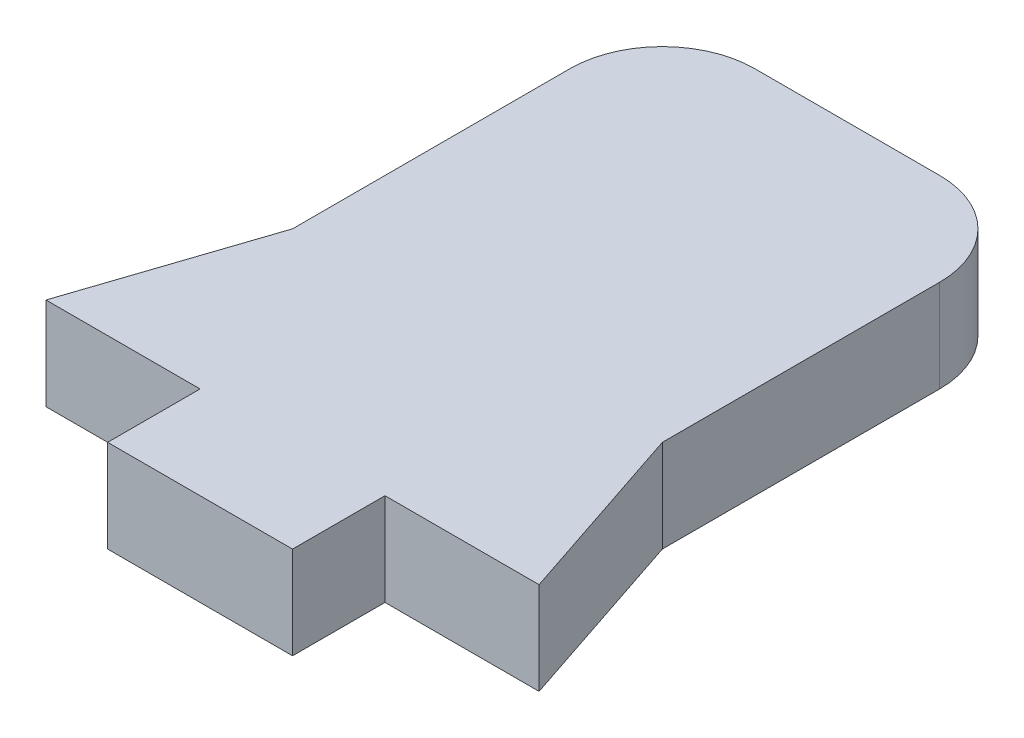
ISO-10303-21;
HEADER;
FILE_DESCRIPTION(('STEP AP214'),'2;1');
FILE_NAME('part.step','',(''),(''),'','','');
FILE_SCHEMA(('AUTOMOTIVE_DESIGN { 1 0 10303 214 1 1 1 1 }'));
ENDSEC;
DATA;
#1=APPLICATION_CONTEXT('core data for automotive mechanical design processes');
#2=APPLICATION_PROTOCOL_DEFINITION('international standard','automotive_design',2000,#1);
#3=PRODUCT_CONTEXT('',#1,'mechanical');
#4=PRODUCT('Part','Part','',(#3));
#5=PRODUCT_RELATED_PRODUCT_CATEGORY('part','',(#4));
#6=PRODUCT_DEFINITION_FORMATION('','',#4);
#7=PRODUCT_DEFINITION_CONTEXT('part definition',#1,'design');
#8=PRODUCT_DEFINITION('design','',#6,#7);
#9=PRODUCT_DEFINITION_SHAPE('','',#8);
#10=(LENGTH_UNIT() NAMED_UNIT(*) SI_UNIT(.MILLI.,.METRE.));
#11=(NAMED_UNIT(*) PLANE_ANGLE_UNIT() SI_UNIT($,.RADIAN.));
#12=(NAMED_UNIT(*) SI_UNIT($,.STERADIAN.) SOLID_ANGLE_UNIT());
#13=UNCERTAINTY_MEASURE_WITH_UNIT(LENGTH_MEASURE(1.E-05),#10,'distance_accuracy_value','');
#14=(GEOMETRIC_REPRESENTATION_CONTEXT(3) GLOBAL_UNCERTAINTY_ASSIGNED_CONTEXT((#13)) GLOBAL_UNIT_ASSIGNED_CONTEXT((#10,
#11,#12)) REPRESENTATION_CONTEXT('',''));
#15=CARTESIAN_POINT('',(0.,0.,0.));
#16=DIRECTION('',(0.,0.,1.));
#17=DIRECTION('',(1.,0.,0.));
#18=AXIS2_PLACEMENT_3D('',#15,#16,#17);
#19=CARTESIAN_POINT('',(6.,1.5,-7.5));
#20=DIRECTION('',(-1.,0.,0.));
#21=DIRECTION('',(0.,0.,1.));
#22=AXIS2_PLACEMENT_3D('',#19,#20,#21);
#23=PLANE('',#22);
#24=DIRECTION('',(0.,-1.,0.));
#25=VECTOR('',#24,1.);
#26=CARTESIAN_POINT('',(6.,1.5,1.5));
#27=LINE('',#26,#25);
#28=CARTESIAN_POINT('',(6.,1.5,1.5));
#29=VERTEX_POINT('',#28);
#30=CARTESIAN_POINT('',(6.,-1.5,1.5));
#31=VERTEX_POINT('',#30);
#32=EDGE_CURVE('E157',#29,#31,#27,.T.);
#33=ORIENTED_EDGE('',*,*,#32,.T.);
#34=DIRECTION('',(0.,0.,-1.));
#35=VECTOR('',#34,1.);
#36=CARTESIAN_POINT('',(6.,-1.5,-7.5));
#37=LINE('',#36,#35);
#38=CARTESIAN_POINT('',(6.,-1.5,-7.5));
#39=VERTEX_POINT('',#38);
#40=EDGE_CURVE('E215',#31,#39,#37,.T.);
#41=ORIENTED_EDGE('',*,*,#40,.T.);
#42=DIRECTION('',(0.,-1.,0.));
#43=VECTOR('',#42,1.);
#44=CARTESIAN_POINT('',(6.,1.5,-7.5));
#45=LINE('',#44,#43);
#46=CARTESIAN_POINT('',(6.,1.5,-7.5));
#47=VERTEX_POINT('',#46);
#48=EDGE_CURVE('E11',#47,#39,#45,.T.);
#49=ORIENTED_EDGE('',*,*,#48,.F.);
#50=DIRECTION('',(0.,0.,-1.));
#51=VECTOR('',#50,1.);
#52=CARTESIAN_POINT('',(6.,1.5,-7.5));
#53=LINE('',#52,#51);
#54=EDGE_CURVE('E58',#29,#47,#53,.T.);
#55=ORIENTED_EDGE('',*,*,#54,.F.);
#56=EDGE_LOOP('',(#33,#41,#49,#55));
#57=FACE_BOUND('',#56,.T.);
#58=ADVANCED_FACE('F43',(#57),#23,.F.);
#59=CARTESIAN_POINT('',(-6.,1.5,-7.5));
#60=DIRECTION('',(1.,0.,0.));
#61=DIRECTION('',(0.,0.,-1.));
#62=AXIS2_PLACEMENT_3D('',#59,#60,#61);
#63=PLANE('',#62);
#64=DIRECTION('',(0.,-1.,0.));
#65=VECTOR('',#64,1.);
#66=CARTESIAN_POINT('',(-6.,1.5,1.5));
#67=LINE('',#66,#65);
#68=CARTESIAN_POINT('',(-6.,1.5,1.5));
#69=VERTEX_POINT('',#68);
#70=CARTESIAN_POINT('',(-6.,-1.5,1.5));
#71=VERTEX_POINT('',#70);
#72=EDGE_CURVE('E66',#69,#71,#67,.T.);
#73=ORIENTED_EDGE('',*,*,#72,.F.);
#74=DIRECTION('',(0.,0.,1.));
#75=VECTOR('',#74,1.);
#76=CARTESIAN_POINT('',(-6.,1.5,-7.5));
#77=LINE('',#76,#75);
#78=CARTESIAN_POINT('',(-6.,1.5,-7.5));
#79=VERTEX_POINT('',#78);
#80=EDGE_CURVE('E146',#79,#69,#77,.T.);
#81=ORIENTED_EDGE('',*,*,#80,.F.);
#82=DIRECTION('',(0.,-1.,0.));
#83=VECTOR('',#82,1.);
#84=CARTESIAN_POINT('',(-6.,1.5,-7.5));
#85=LINE('',#84,#83);
#86=CARTESIAN_POINT('',(-6.,-1.5,-7.5));
#87=VERTEX_POINT('',#86);
#88=EDGE_CURVE('E232',#79,#87,#85,.T.);
#89=ORIENTED_EDGE('',*,*,#88,.T.);
#90=DIRECTION('',(0.,0.,1.));
#91=VECTOR('',#90,1.);
#92=CARTESIAN_POINT('',(-6.,-1.5,-7.5));
#93=LINE('',#92,#91);
#94=EDGE_CURVE('E244',#87,#71,#93,.T.);
#95=ORIENTED_EDGE('',*,*,#94,.T.);
#96=EDGE_LOOP('',(#73,#81,#89,#95));
#97=FACE_BOUND('',#96,.T.);
#98=ADVANCED_FACE('F276',(#97),#63,.F.);
#99=CARTESIAN_POINT('',(-6.,1.5,7.5));
#100=DIRECTION('',(0.,0.,-1.));
#101=DIRECTION('',(-1.,0.,0.));
#102=AXIS2_PLACEMENT_3D('',#99,#100,#101);
#103=PLANE('',#102);
#104=DIRECTION('',(0.,-1.,0.));
#105=VECTOR('',#104,1.);
#106=CARTESIAN_POINT('',(-3.00000000000001,1.5,7.5));
#107=LINE('',#106,#105);
#108=CARTESIAN_POINT('',(-3.00000000000001,1.5,7.5));
#109=VERTEX_POINT('',#108);
#110=CARTESIAN_POINT('',(-3.00000000000001,-1.5,7.5));
#111=VERTEX_POINT('',#110);
#112=EDGE_CURVE('E193',#109,#111,#107,.T.);
#113=ORIENTED_EDGE('',*,*,#112,.F.);
#114=DIRECTION('',(1.,0.,0.));
#115=VECTOR('',#114,1.);
#116=CARTESIAN_POINT('',(-6.,1.5,7.5));
#117=LINE('',#116,#115);
#118=CARTESIAN_POINT('',(-8.,1.5,7.5));
#119=VERTEX_POINT('',#118);
#120=EDGE_CURVE('E145',#119,#109,#117,.T.);
#121=ORIENTED_EDGE('',*,*,#120,.F.);
#122=DIRECTION('',(0.,-1.,0.));
#123=VECTOR('',#122,1.);
#124=CARTESIAN_POINT('',(-8.,1.5,7.5));
#125=LINE('',#124,#123);
#126=CARTESIAN_POINT('',(-8.,-1.5,7.5));
#127=VERTEX_POINT('',#126);
#128=EDGE_CURVE('E173',#119,#127,#125,.T.);
#129=ORIENTED_EDGE('',*,*,#128,.T.);
#130=DIRECTION('',(1.,0.,0.));
#131=VECTOR('',#130,1.);
#132=CARTESIAN_POINT('',(-6.,-1.5,7.5));
#133=LINE('',#132,#131);
#134=EDGE_CURVE('E219',#127,#111,#133,.T.);
#135=ORIENTED_EDGE('',*,*,#134,.T.);
#136=EDGE_LOOP('',(#113,#121,#129,#135));
#137=FACE_BOUND('',#136,.T.);
#138=ADVANCED_FACE('F283',(#137),#103,.F.);
#139=CARTESIAN_POINT('',(3.,1.5,-7.5));
#140=DIRECTION('',(0.,-1.,0.));
#141=DIRECTION('',(0.,0.,-1.));
#142=AXIS2_PLACEMENT_3D('',#139,#140,#141);
#143=CYLINDRICAL_SURFACE('',#142,3.);
#144=CARTESIAN_POINT('',(3.,-1.5,-7.5));
#145=DIRECTION('',(0.,1.,0.));
#146=DIRECTION('',(0.,0.,-1.));
#147=AXIS2_PLACEMENT_3D('',#144,#145,#146);
#148=CIRCLE('',#147,3.);
#149=CARTESIAN_POINT('',(3.,-1.5,-10.5));
#150=VERTEX_POINT('',#149);
#151=EDGE_CURVE('E235',#39,#150,#148,.T.);
#152=ORIENTED_EDGE('',*,*,#151,.T.);
#153=DIRECTION('',(0.,-1.,0.));
#154=VECTOR('',#153,1.);
#155=CARTESIAN_POINT('',(3.,1.5,-10.5));
#156=LINE('',#155,#154);
#157=CARTESIAN_POINT('',(3.,1.5,-10.5));
#158=VERTEX_POINT('',#157);
#159=EDGE_CURVE('E51',#158,#150,#156,.T.);
#160=ORIENTED_EDGE('',*,*,#159,.F.);
#161=CARTESIAN_POINT('',(3.,1.5,-7.5));
#162=DIRECTION('',(0.,1.,0.));
#163=DIRECTION('',(0.,0.,-1.));
#164=AXIS2_PLACEMENT_3D('',#161,#162,#163);
#165=CIRCLE('',#164,3.);
#166=EDGE_CURVE('E218',#47,#158,#165,.T.);
#167=ORIENTED_EDGE('',*,*,#166,.F.);
#168=ORIENTED_EDGE('',*,*,#48,.T.);
#169=EDGE_LOOP('',(#152,#160,#167,#168));
#170=FACE_BOUND('',#169,.T.);
#171=ADVANCED_FACE('F304',(#170),#143,.T.);
#172=CARTESIAN_POINT('',(-3.,1.5,-10.5));
#173=DIRECTION('',(0.,0.,1.));
#174=DIRECTION('',(1.,0.,0.));
#175=AXIS2_PLACEMENT_3D('',#172,#173,#174);
#176=PLANE('',#175);
#177=DIRECTION('',(-1.,0.,0.));
#178=VECTOR('',#177,1.);
#179=CARTESIAN_POINT('',(-3.,-1.5,-10.5));
#180=LINE('',#179,#178);
#181=CARTESIAN_POINT('',(-3.,-1.5,-10.5));
#182=VERTEX_POINT('',#181);
#183=EDGE_CURVE('E238',#150,#182,#180,.T.);
#184=ORIENTED_EDGE('',*,*,#183,.T.);
#185=DIRECTION('',(0.,-1.,0.));
#186=VECTOR('',#185,1.);
#187=CARTESIAN_POINT('',(-3.,1.5,-10.5));
#188=LINE('',#187,#186);
#189=CARTESIAN_POINT('',(-3.,1.5,-10.5));
#190=VERTEX_POINT('',#189);
#191=EDGE_CURVE('E253',#190,#182,#188,.T.);
#192=ORIENTED_EDGE('',*,*,#191,.F.);
#193=DIRECTION('',(-1.,0.,0.));
#194=VECTOR('',#193,1.);
#195=CARTESIAN_POINT('',(-3.,1.5,-10.5));
#196=LINE('',#195,#194);
#197=EDGE_CURVE('E222',#158,#190,#196,.T.);
#198=ORIENTED_EDGE('',*,*,#197,.F.);
#199=ORIENTED_EDGE('',*,*,#159,.T.);
#200=EDGE_LOOP('',(#184,#192,#198,#199));
#201=FACE_BOUND('',#200,.T.);
#202=ADVANCED_FACE('F262',(#201),#176,.F.);
#203=CARTESIAN_POINT('',(-3.,1.5,-7.5));
#204=DIRECTION('',(0.,-1.,0.));
#205=DIRECTION('',(0.,0.,-1.));
#206=AXIS2_PLACEMENT_3D('',#203,#204,#205);
#207=CYLINDRICAL_SURFACE('',#206,3.);
#208=CARTESIAN_POINT('',(-3.,-1.5,-7.5));
#209=DIRECTION('',(0.,1.,0.));
#210=DIRECTION('',(0.,0.,1.));
#211=AXIS2_PLACEMENT_3D('',#208,#209,#210);
#212=CIRCLE('',#211,3.);
#213=EDGE_CURVE('E241',#182,#87,#212,.T.);
#214=ORIENTED_EDGE('',*,*,#213,.T.);
#215=ORIENTED_EDGE('',*,*,#88,.F.);
#216=CARTESIAN_POINT('',(-3.,1.5,-7.5));
#217=DIRECTION('',(0.,1.,0.));
#218=DIRECTION('',(0.,0.,1.));
#219=AXIS2_PLACEMENT_3D('',#216,#217,#218);
#220=CIRCLE('',#219,3.);
#221=EDGE_CURVE('E225',#190,#79,#220,.T.);
#222=ORIENTED_EDGE('',*,*,#221,.F.);
#223=ORIENTED_EDGE('',*,*,#191,.T.);
#224=EDGE_LOOP('',(#214,#215,#222,#223));
#225=FACE_BOUND('',#224,.T.);
#226=ADVANCED_FACE('F274',(#225),#207,.T.);
#227=CARTESIAN_POINT('',(3.00000000000001,1.5,7.5));
#228=VERTEX_POINT('',#227);
#229=CARTESIAN_POINT('',(8.,1.5,7.5));
#230=VERTEX_POINT('',#229);
#231=EDGE_CURVE('E133',#228,#230,#117,.T.);
#232=ORIENTED_EDGE('',*,*,#231,.F.);
#233=DIRECTION('',(0.,-1.,0.));
#234=VECTOR('',#233,1.);
#235=CARTESIAN_POINT('',(3.00000000000001,1.5,7.5));
#236=LINE('',#235,#234);
#237=CARTESIAN_POINT('',(3.00000000000001,-1.5,7.5));
#238=VERTEX_POINT('',#237);
#239=EDGE_CURVE('E204',#228,#238,#236,.T.);
#240=ORIENTED_EDGE('',*,*,#239,.T.);
#241=CARTESIAN_POINT('',(8.,-1.5,7.5));
#242=VERTEX_POINT('',#241);
#243=EDGE_CURVE('E152',#238,#242,#133,.T.);
#244=ORIENTED_EDGE('',*,*,#243,.T.);
#245=DIRECTION('',(0.,-1.,0.));
#246=VECTOR('',#245,1.);
#247=CARTESIAN_POINT('',(8.,1.5,7.5));
#248=LINE('',#247,#246);
#249=EDGE_CURVE('E149',#230,#242,#248,.T.);
#250=ORIENTED_EDGE('',*,*,#249,.F.);
#251=EDGE_LOOP('',(#232,#240,#244,#250));
#252=FACE_BOUND('',#251,.T.);
#253=ADVANCED_FACE('F150',(#252),#103,.F.);
#254=CARTESIAN_POINT('',(-3.,1.5,-7.5));
#255=DIRECTION('',(0.,1.,0.));
#256=DIRECTION('',(0.,0.,1.));
#257=AXIS2_PLACEMENT_3D('',#254,#255,#256);
#258=PLANE('',#257);
#259=ORIENTED_EDGE('',*,*,#231,.T.);
#260=DIRECTION('',(-0.316227766016838,0.,-0.948683298050514));
#261=VECTOR('',#260,1.);
#262=CARTESIAN_POINT('',(6.,1.5,1.5));
#263=LINE('',#262,#261);
#264=EDGE_CURVE('E137',#230,#29,#263,.T.);
#265=ORIENTED_EDGE('',*,*,#264,.T.);
#266=ORIENTED_EDGE('',*,*,#54,.T.);
#267=ORIENTED_EDGE('',*,*,#166,.T.);
#268=ORIENTED_EDGE('',*,*,#197,.T.);
#269=ORIENTED_EDGE('',*,*,#221,.T.);
#270=ORIENTED_EDGE('',*,*,#80,.T.);
#271=DIRECTION('',(-0.316227766016838,0.,0.948683298050514));
#272=VECTOR('',#271,1.);
#273=CARTESIAN_POINT('',(-6.,1.5,1.5));
#274=LINE('',#273,#272);
#275=EDGE_CURVE('E169',#69,#119,#274,.T.);
#276=ORIENTED_EDGE('',*,*,#275,.T.);
#277=ORIENTED_EDGE('',*,*,#120,.T.);
#278=DIRECTION('',(0.,0.,1.));
#279=VECTOR('',#278,1.);
#280=CARTESIAN_POINT('',(-3.00000000000001,1.5,7.5));
#281=LINE('',#280,#279);
#282=CARTESIAN_POINT('',(-3.00000000000001,1.5,10.5));
#283=VERTEX_POINT('',#282);
#284=EDGE_CURVE('E183',#109,#283,#281,.T.);
#285=ORIENTED_EDGE('',*,*,#284,.T.);
#286=DIRECTION('',(1.,0.,0.));
#287=VECTOR('',#286,1.);
#288=CARTESIAN_POINT('',(-3.00000000000001,1.5,10.5));
#289=LINE('',#288,#287);
#290=CARTESIAN_POINT('',(2.99999999999999,1.5,10.5));
#291=VERTEX_POINT('',#290);
#292=EDGE_CURVE('E187',#283,#291,#289,.T.);
#293=ORIENTED_EDGE('',*,*,#292,.T.);
#294=DIRECTION('',(0.,0.,-1.));
#295=VECTOR('',#294,1.);
#296=CARTESIAN_POINT('',(3.00000000000001,1.5,7.5));
#297=LINE('',#296,#295);
#298=EDGE_CURVE('E140',#291,#228,#297,.T.);
#299=ORIENTED_EDGE('',*,*,#298,.T.);
#300=EDGE_LOOP('',(#259,#265,#266,#267,#268,#269,#270,#276,#277,#285,#293,#299));
#301=FACE_BOUND('',#300,.T.);
#302=ADVANCED_FACE('F135',(#301),#258,.T.);
#303=CARTESIAN_POINT('',(-3.,-1.5,-7.5));
#304=DIRECTION('',(0.,1.,0.));
#305=DIRECTION('',(0.,0.,1.));
#306=AXIS2_PLACEMENT_3D('',#303,#304,#305);
#307=PLANE('',#306);
#308=ORIENTED_EDGE('',*,*,#40,.F.);
#309=DIRECTION('',(-0.316227766016838,0.,-0.948683298050514));
#310=VECTOR('',#309,1.);
#311=CARTESIAN_POINT('',(6.,-1.5,1.5));
#312=LINE('',#311,#310);
#313=EDGE_CURVE('E161',#242,#31,#312,.T.);
#314=ORIENTED_EDGE('',*,*,#313,.F.);
#315=ORIENTED_EDGE('',*,*,#243,.F.);
#316=DIRECTION('',(0.,0.,-1.));
#317=VECTOR('',#316,1.);
#318=CARTESIAN_POINT('',(3.00000000000001,-1.5,7.5));
#319=LINE('',#318,#317);
#320=CARTESIAN_POINT('',(2.99999999999999,-1.5,10.5));
#321=VERTEX_POINT('',#320);
#322=EDGE_CURVE('E188',#321,#238,#319,.T.);
#323=ORIENTED_EDGE('',*,*,#322,.F.);
#324=DIRECTION('',(1.,0.,0.));
#325=VECTOR('',#324,1.);
#326=CARTESIAN_POINT('',(-3.00000000000001,-1.5,10.5));
#327=LINE('',#326,#325);
#328=CARTESIAN_POINT('',(-3.00000000000001,-1.5,10.5));
#329=VERTEX_POINT('',#328);
#330=EDGE_CURVE('E197',#329,#321,#327,.T.);
#331=ORIENTED_EDGE('',*,*,#330,.F.);
#332=DIRECTION('',(0.,0.,1.));
#333=VECTOR('',#332,1.);
#334=CARTESIAN_POINT('',(-3.00000000000001,-1.5,7.5));
#335=LINE('',#334,#333);
#336=EDGE_CURVE('E182',#111,#329,#335,.T.);
#337=ORIENTED_EDGE('',*,*,#336,.F.);
#338=ORIENTED_EDGE('',*,*,#134,.F.);
#339=DIRECTION('',(-0.316227766016838,0.,0.948683298050514));
#340=VECTOR('',#339,1.);
#341=CARTESIAN_POINT('',(-6.,-1.5,1.5));
#342=LINE('',#341,#340);
#343=EDGE_CURVE('E168',#71,#127,#342,.T.);
#344=ORIENTED_EDGE('',*,*,#343,.F.);
#345=ORIENTED_EDGE('',*,*,#94,.F.);
#346=ORIENTED_EDGE('',*,*,#213,.F.);
#347=ORIENTED_EDGE('',*,*,#183,.F.);
#348=ORIENTED_EDGE('',*,*,#151,.F.);
#349=EDGE_LOOP('',(#308,#314,#315,#323,#331,#337,#338,#344,#345,#346,#347,#348));
#350=FACE_BOUND('',#349,.T.);
#351=ADVANCED_FACE('F269',(#350),#307,.F.);
#352=CARTESIAN_POINT('',(-3.00000000000001,1.5,7.5));
#353=DIRECTION('',(1.,0.,0.));
#354=DIRECTION('',(0.,0.,-1.));
#355=AXIS2_PLACEMENT_3D('',#352,#353,#354);
#356=PLANE('',#355);
#357=ORIENTED_EDGE('',*,*,#336,.T.);
#358=DIRECTION('',(0.,-1.,0.));
#359=VECTOR('',#358,1.);
#360=CARTESIAN_POINT('',(-3.00000000000001,1.5,10.5));
#361=LINE('',#360,#359);
#362=EDGE_CURVE('E211',#283,#329,#361,.T.);
#363=ORIENTED_EDGE('',*,*,#362,.F.);
#364=ORIENTED_EDGE('',*,*,#284,.F.);
#365=ORIENTED_EDGE('',*,*,#112,.T.);
#366=EDGE_LOOP('',(#357,#363,#364,#365));
#367=FACE_BOUND('',#366,.T.);
#368=ADVANCED_FACE('F287',(#367),#356,.F.);
#369=CARTESIAN_POINT('',(-3.00000000000001,1.5,10.5));
#370=DIRECTION('',(0.,0.,-1.));
#371=DIRECTION('',(-1.,0.,0.));
#372=AXIS2_PLACEMENT_3D('',#369,#370,#371);
#373=PLANE('',#372);
#374=ORIENTED_EDGE('',*,*,#330,.T.);
#375=DIRECTION('',(0.,-1.,0.));
#376=VECTOR('',#375,1.);
#377=CARTESIAN_POINT('',(2.99999999999999,1.5,10.5));
#378=LINE('',#377,#376);
#379=EDGE_CURVE('E207',#291,#321,#378,.T.);
#380=ORIENTED_EDGE('',*,*,#379,.F.);
#381=ORIENTED_EDGE('',*,*,#292,.F.);
#382=ORIENTED_EDGE('',*,*,#362,.T.);
#383=EDGE_LOOP('',(#374,#380,#381,#382));
#384=FACE_BOUND('',#383,.T.);
#385=ADVANCED_FACE('F290',(#384),#373,.F.);
#386=CARTESIAN_POINT('',(3.00000000000001,1.5,7.5));
#387=DIRECTION('',(-1.,0.,0.));
#388=DIRECTION('',(0.,0.,1.));
#389=AXIS2_PLACEMENT_3D('',#386,#387,#388);
#390=PLANE('',#389);
#391=ORIENTED_EDGE('',*,*,#322,.T.);
#392=ORIENTED_EDGE('',*,*,#239,.F.);
#393=ORIENTED_EDGE('',*,*,#298,.F.);
#394=ORIENTED_EDGE('',*,*,#379,.T.);
#395=EDGE_LOOP('',(#391,#392,#393,#394));
#396=FACE_BOUND('',#395,.T.);
#397=ADVANCED_FACE('F293',(#396),#390,.F.);
#398=CARTESIAN_POINT('',(-6.,1.5,1.5));
#399=DIRECTION('',(0.948683298050514,0.,0.316227766016838));
#400=DIRECTION('',(0.316227766016838,0.,-0.948683298050514));
#401=AXIS2_PLACEMENT_3D('',#398,#399,#400);
#402=PLANE('',#401);
#403=ORIENTED_EDGE('',*,*,#343,.T.);
#404=ORIENTED_EDGE('',*,*,#128,.F.);
#405=ORIENTED_EDGE('',*,*,#275,.F.);
#406=ORIENTED_EDGE('',*,*,#72,.T.);
#407=EDGE_LOOP('',(#403,#404,#405,#406));
#408=FACE_BOUND('',#407,.T.);
#409=ADVANCED_FACE('F280',(#408),#402,.F.);
#410=CARTESIAN_POINT('',(6.,1.5,1.5));
#411=DIRECTION('',(-0.948683298050514,0.,0.316227766016838));
#412=DIRECTION('',(0.316227766016838,0.,0.948683298050514));
#413=AXIS2_PLACEMENT_3D('',#410,#411,#412);
#414=PLANE('',#413);
#415=ORIENTED_EDGE('',*,*,#313,.T.);
#416=ORIENTED_EDGE('',*,*,#32,.F.);
#417=ORIENTED_EDGE('',*,*,#264,.F.);
#418=ORIENTED_EDGE('',*,*,#249,.T.);
#419=EDGE_LOOP('',(#415,#416,#417,#418));
#420=FACE_BOUND('',#419,.T.);
#421=ADVANCED_FACE('F159',(#420),#414,.F.);
#422=CLOSED_SHELL('',(#58,#98,#138,#171,#202,#226,#253,#302,#351,#368,#385,#397,#409,#421));
#423=MANIFOLD_SOLID_BREP('B2',#422);
#424=ADVANCED_BREP_SHAPE_REPRESENTATION('',(#18,#423),#14);
#425=SHAPE_DEFINITION_REPRESENTATION(#9,#424);
ENDSEC;
END-ISO-10303-21;
